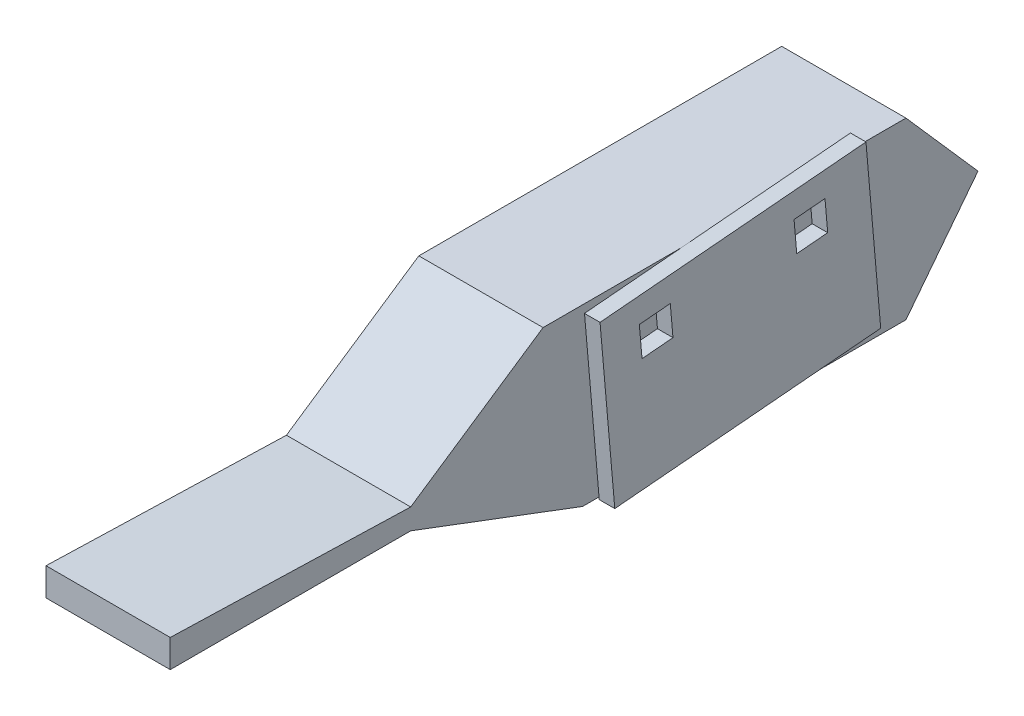
ISO-10303-21;
HEADER;
FILE_DESCRIPTION(('STEP AP214'),'2;1');
FILE_NAME('part.step','',(''),(''),'','','');
FILE_SCHEMA(('AUTOMOTIVE_DESIGN { 1 0 10303 214 1 1 1 1 }'));
ENDSEC;
DATA;
#1=APPLICATION_CONTEXT('core data for automotive mechanical design processes');
#2=APPLICATION_PROTOCOL_DEFINITION('international standard','automotive_design',2000,#1);
#3=PRODUCT_CONTEXT('',#1,'mechanical');
#4=PRODUCT('Part','Part','',(#3));
#5=PRODUCT_RELATED_PRODUCT_CATEGORY('part','',(#4));
#6=PRODUCT_DEFINITION_FORMATION('','',#4);
#7=PRODUCT_DEFINITION_CONTEXT('part definition',#1,'design');
#8=PRODUCT_DEFINITION('design','',#6,#7);
#9=PRODUCT_DEFINITION_SHAPE('','',#8);
#10=(LENGTH_UNIT() NAMED_UNIT(*) SI_UNIT(.MILLI.,.METRE.));
#11=(NAMED_UNIT(*) PLANE_ANGLE_UNIT() SI_UNIT($,.RADIAN.));
#12=(NAMED_UNIT(*) SI_UNIT($,.STERADIAN.) SOLID_ANGLE_UNIT());
#13=UNCERTAINTY_MEASURE_WITH_UNIT(LENGTH_MEASURE(1.E-05),#10,'distance_accuracy_value','');
#14=(GEOMETRIC_REPRESENTATION_CONTEXT(3) GLOBAL_UNCERTAINTY_ASSIGNED_CONTEXT((#13)) GLOBAL_UNIT_ASSIGNED_CONTEXT((#10,
#11,#12)) REPRESENTATION_CONTEXT('',''));
#15=CARTESIAN_POINT('',(0.,0.,0.));
#16=DIRECTION('',(0.,0.,1.));
#17=DIRECTION('',(1.,0.,0.));
#18=AXIS2_PLACEMENT_3D('',#15,#16,#17);
#19=CARTESIAN_POINT('',(12.7,0.,0.));
#20=DIRECTION('',(1.,0.,0.));
#21=DIRECTION('',(0.,0.,-1.));
#22=AXIS2_PLACEMENT_3D('',#19,#20,#21);
#23=PLANE('',#22);
#24=DIRECTION('',(0.,-0.996194698091746,-0.0871557427476585));
#25=VECTOR('',#24,1.);
#26=CARTESIAN_POINT('',(12.7,-17.985294414633,29.7471624312923));
#27=LINE('',#26,#25);
#28=CARTESIAN_POINT('',(12.7,16.5040211284524,32.7645865540807));
#29=VERTEX_POINT('',#28);
#30=CARTESIAN_POINT('',(12.7,-17.4885188657028,29.7906246601406));
#31=VERTEX_POINT('',#30);
#32=EDGE_CURVE('E58',#29,#31,#27,.T.);
#33=ORIENTED_EDGE('',*,*,#32,.F.);
#34=DIRECTION('',(0.,-0.0871557427476582,0.996194698091745));
#35=VECTOR('',#34,1.);
#36=CARTESIAN_POINT('',(12.7,16.5040211284524,32.7645865540807));
#37=LINE('',#36,#35);
#38=CARTESIAN_POINT('',(12.7,18.2248775547851,13.0951075955551));
#39=VERTEX_POINT('',#38);
#40=EDGE_CURVE('E11',#39,#29,#37,.T.);
#41=ORIENTED_EDGE('',*,*,#40,.F.);
#42=DIRECTION('',(0.,0.,1.));
#43=VECTOR('',#42,1.);
#44=CARTESIAN_POINT('',(12.7,18.2248775547851,41.2360865886046));
#45=LINE('',#44,#43);
#46=CARTESIAN_POINT('',(12.7,18.2248775547851,41.2360865886046));
#47=VERTEX_POINT('',#46);
#48=EDGE_CURVE('E363',#39,#47,#45,.T.);
#49=ORIENTED_EDGE('',*,*,#48,.T.);
#50=DIRECTION('',(0.,-0.558600379479065,0.829436927105277));
#51=VECTOR('',#50,1.);
#52=CARTESIAN_POINT('',(12.7,0.,68.2972684123763));
#53=LINE('',#52,#51);
#54=CARTESIAN_POINT('',(12.7,0.,68.2972684123763));
#55=VERTEX_POINT('',#54);
#56=EDGE_CURVE('E368',#47,#55,#53,.T.);
#57=ORIENTED_EDGE('',*,*,#56,.T.);
#58=DIRECTION('',(0.,0.0299491063641705,0.999551424904185));
#59=VECTOR('',#58,1.);
#60=CARTESIAN_POINT('',(12.7,1.47271737816446,117.449210908615));
#61=LINE('',#60,#59);
#62=CARTESIAN_POINT('',(12.7,1.47271737816446,117.449210908615));
#63=VERTEX_POINT('',#62);
#64=EDGE_CURVE('E338',#55,#63,#61,.T.);
#65=ORIENTED_EDGE('',*,*,#64,.T.);
#66=DIRECTION('',(0.,-1.,0.));
#67=VECTOR('',#66,1.);
#68=CARTESIAN_POINT('',(12.7,-4.23406246222278,117.449210908615));
#69=LINE('',#68,#67);
#70=CARTESIAN_POINT('',(12.7,-4.23406246222278,117.449210908615));
#71=VERTEX_POINT('',#70);
#72=EDGE_CURVE('E342',#63,#71,#69,.T.);
#73=ORIENTED_EDGE('',*,*,#72,.T.);
#74=DIRECTION('',(0.,0.,-1.));
#75=VECTOR('',#74,1.);
#76=CARTESIAN_POINT('',(12.7,-4.23406246222278,68.2972684123763));
#77=LINE('',#76,#75);
#78=CARTESIAN_POINT('',(12.7,-4.23406246222278,68.2972684123763));
#79=VERTEX_POINT('',#78);
#80=EDGE_CURVE('E346',#71,#79,#77,.T.);
#81=ORIENTED_EDGE('',*,*,#80,.T.);
#82=DIRECTION('',(0.,-0.35273357770288,-0.935723796406251));
#83=VECTOR('',#82,1.);
#84=CARTESIAN_POINT('',(12.7,-17.4885188657028,33.1361410087001));
#85=LINE('',#84,#83);
#86=CARTESIAN_POINT('',(12.7,-17.4885188657028,33.1361410087001));
#87=VERTEX_POINT('',#86);
#88=EDGE_CURVE('E349',#79,#87,#85,.T.);
#89=ORIENTED_EDGE('',*,*,#88,.T.);
#90=DIRECTION('',(0.,0.,-1.));
#91=VECTOR('',#90,1.);
#92=CARTESIAN_POINT('',(12.7,-17.4885188657028,-32.9520513364295));
#93=LINE('',#92,#91);
#94=EDGE_CURVE('E353',#87,#31,#93,.T.);
#95=ORIENTED_EDGE('',*,*,#94,.T.);
#96=EDGE_LOOP('',(#33,#41,#49,#57,#65,#73,#81,#89,#95));
#97=FACE_BOUND('',#96,.T.);
#98=ADVANCED_FACE('F39',(#97),#23,.T.);
#99=CARTESIAN_POINT('',(12.7,1.47271737816446,117.449210908615));
#100=DIRECTION('',(0.,-0.999551424904185,0.0299491063641705));
#101=DIRECTION('',(0.,-0.0299491063641705,-0.999551424904185));
#102=AXIS2_PLACEMENT_3D('',#99,#100,#101);
#103=PLANE('',#102);
#104=DIRECTION('',(0.,0.0299491063641705,0.999551424904185));
#105=VECTOR('',#104,1.);
#106=CARTESIAN_POINT('',(-12.7,1.47271737816446,117.449210908615));
#107=LINE('',#106,#105);
#108=CARTESIAN_POINT('',(-12.7,0.,68.2972684123763));
#109=VERTEX_POINT('',#108);
#110=CARTESIAN_POINT('',(-12.7,1.47271737816446,117.449210908615));
#111=VERTEX_POINT('',#110);
#112=EDGE_CURVE('E337',#109,#111,#107,.T.);
#113=ORIENTED_EDGE('',*,*,#112,.T.);
#114=DIRECTION('',(-1.,0.,0.));
#115=VECTOR('',#114,1.);
#116=CARTESIAN_POINT('',(12.7,1.47271737816446,117.449210908615));
#117=LINE('',#116,#115);
#118=EDGE_CURVE('E43',#63,#111,#117,.T.);
#119=ORIENTED_EDGE('',*,*,#118,.F.);
#120=ORIENTED_EDGE('',*,*,#64,.F.);
#121=DIRECTION('',(-1.,0.,0.));
#122=VECTOR('',#121,1.);
#123=CARTESIAN_POINT('',(12.7,0.,68.2972684123763));
#124=LINE('',#123,#122);
#125=EDGE_CURVE('E372',#55,#109,#124,.T.);
#126=ORIENTED_EDGE('',*,*,#125,.T.);
#127=EDGE_LOOP('',(#113,#119,#120,#126));
#128=FACE_BOUND('',#127,.T.);
#129=ADVANCED_FACE('F41',(#128),#103,.F.);
#130=CARTESIAN_POINT('',(12.7,-4.23406246222278,117.449210908615));
#131=DIRECTION('',(0.,0.,-1.));
#132=DIRECTION('',(-1.,0.,0.));
#133=AXIS2_PLACEMENT_3D('',#130,#131,#132);
#134=PLANE('',#133);
#135=DIRECTION('',(0.,-1.,0.));
#136=VECTOR('',#135,1.);
#137=CARTESIAN_POINT('',(-12.7,-4.23406246222278,117.449210908615));
#138=LINE('',#137,#136);
#139=CARTESIAN_POINT('',(-12.7,-4.23406246222278,117.449210908615));
#140=VERTEX_POINT('',#139);
#141=EDGE_CURVE('E376',#111,#140,#138,.T.);
#142=ORIENTED_EDGE('',*,*,#141,.T.);
#143=DIRECTION('',(-1.,0.,0.));
#144=VECTOR('',#143,1.);
#145=CARTESIAN_POINT('',(12.7,-4.23406246222278,117.449210908615));
#146=LINE('',#145,#144);
#147=EDGE_CURVE('E425',#71,#140,#146,.T.);
#148=ORIENTED_EDGE('',*,*,#147,.F.);
#149=ORIENTED_EDGE('',*,*,#72,.F.);
#150=ORIENTED_EDGE('',*,*,#118,.T.);
#151=EDGE_LOOP('',(#142,#148,#149,#150));
#152=FACE_BOUND('',#151,.T.);
#153=ADVANCED_FACE('F505',(#152),#134,.F.);
#154=CARTESIAN_POINT('',(12.7,-4.23406246222278,68.2972684123763));
#155=DIRECTION('',(0.,1.,0.));
#156=DIRECTION('',(0.,0.,1.));
#157=AXIS2_PLACEMENT_3D('',#154,#155,#156);
#158=PLANE('',#157);
#159=DIRECTION('',(0.,0.,-1.));
#160=VECTOR('',#159,1.);
#161=CARTESIAN_POINT('',(-12.7,-4.23406246222278,68.2972684123763));
#162=LINE('',#161,#160);
#163=CARTESIAN_POINT('',(-12.7,-4.23406246222278,68.2972684123763));
#164=VERTEX_POINT('',#163);
#165=EDGE_CURVE('E379',#140,#164,#162,.T.);
#166=ORIENTED_EDGE('',*,*,#165,.T.);
#167=DIRECTION('',(-1.,0.,0.));
#168=VECTOR('',#167,1.);
#169=CARTESIAN_POINT('',(12.7,-4.23406246222278,68.2972684123763));
#170=LINE('',#169,#168);
#171=EDGE_CURVE('E422',#79,#164,#170,.T.);
#172=ORIENTED_EDGE('',*,*,#171,.F.);
#173=ORIENTED_EDGE('',*,*,#80,.F.);
#174=ORIENTED_EDGE('',*,*,#147,.T.);
#175=EDGE_LOOP('',(#166,#172,#173,#174));
#176=FACE_BOUND('',#175,.T.);
#177=ADVANCED_FACE('F507',(#176),#158,.F.);
#178=CARTESIAN_POINT('',(12.7,-17.4885188657028,33.1361410087001));
#179=DIRECTION('',(0.,0.935723796406251,-0.35273357770288));
#180=DIRECTION('',(0.,0.35273357770288,0.935723796406251));
#181=AXIS2_PLACEMENT_3D('',#178,#179,#180);
#182=PLANE('',#181);
#183=DIRECTION('',(0.,-0.35273357770288,-0.935723796406251));
#184=VECTOR('',#183,1.);
#185=CARTESIAN_POINT('',(-12.7,-17.4885188657028,33.1361410087001));
#186=LINE('',#185,#184);
#187=CARTESIAN_POINT('',(-12.7,-17.4885188657028,33.1361410087001));
#188=VERTEX_POINT('',#187);
#189=EDGE_CURVE('E382',#164,#188,#186,.T.);
#190=ORIENTED_EDGE('',*,*,#189,.T.);
#191=DIRECTION('',(-1.,0.,0.));
#192=VECTOR('',#191,1.);
#193=CARTESIAN_POINT('',(12.7,-17.4885188657028,33.1361410087001));
#194=LINE('',#193,#192);
#195=EDGE_CURVE('E418',#87,#188,#194,.T.);
#196=ORIENTED_EDGE('',*,*,#195,.F.);
#197=ORIENTED_EDGE('',*,*,#88,.F.);
#198=ORIENTED_EDGE('',*,*,#171,.T.);
#199=EDGE_LOOP('',(#190,#196,#197,#198));
#200=FACE_BOUND('',#199,.T.);
#201=ADVANCED_FACE('F511',(#200),#182,.F.);
#202=CARTESIAN_POINT('',(12.7,-17.4885188657028,-32.9520513364295));
#203=DIRECTION('',(0.,1.,0.));
#204=DIRECTION('',(0.,0.,1.));
#205=AXIS2_PLACEMENT_3D('',#202,#203,#204);
#206=PLANE('',#205);
#207=DIRECTION('',(0.,0.,-1.));
#208=VECTOR('',#207,1.);
#209=CARTESIAN_POINT('',(-12.7,-17.4885188657028,-32.9520513364295));
#210=LINE('',#209,#208);
#211=CARTESIAN_POINT('',(-12.7,-17.4885188657028,-32.9520513364295));
#212=VERTEX_POINT('',#211);
#213=EDGE_CURVE('E385',#188,#212,#210,.T.);
#214=ORIENTED_EDGE('',*,*,#213,.T.);
#215=DIRECTION('',(-1.,0.,0.));
#216=VECTOR('',#215,1.);
#217=CARTESIAN_POINT('',(12.7,-17.4885188657028,-32.9520513364295));
#218=LINE('',#217,#216);
#219=CARTESIAN_POINT('',(12.7,-17.4885188657028,-32.9520513364295));
#220=VERTEX_POINT('',#219);
#221=EDGE_CURVE('E414',#220,#212,#218,.T.);
#222=ORIENTED_EDGE('',*,*,#221,.F.);
#223=CARTESIAN_POINT('',(12.7,-17.4885188657029,24.0689919242895));
#224=VERTEX_POINT('',#223);
#225=EDGE_CURVE('E352',#224,#220,#93,.T.);
#226=ORIENTED_EDGE('',*,*,#225,.F.);
#227=EDGE_CURVE('E357',#31,#224,#93,.T.);
#228=ORIENTED_EDGE('',*,*,#227,.F.);
#229=ORIENTED_EDGE('',*,*,#94,.F.);
#230=ORIENTED_EDGE('',*,*,#195,.T.);
#231=EDGE_LOOP('',(#214,#222,#226,#228,#229,#230));
#232=FACE_BOUND('',#231,.T.);
#233=ADVANCED_FACE('F468',(#232),#206,.F.);
#234=CARTESIAN_POINT('',(12.7,1.47271737816446,-47.679225118074));
#235=DIRECTION('',(0.,0.613409639422925,0.789764910757015));
#236=DIRECTION('',(0.,-0.789764910757015,0.613409639422925));
#237=AXIS2_PLACEMENT_3D('',#234,#235,#236);
#238=PLANE('',#237);
#239=DIRECTION('',(0.,0.789764910757015,-0.613409639422925));
#240=VECTOR('',#239,1.);
#241=CARTESIAN_POINT('',(-12.7,1.47271737816446,-47.679225118074));
#242=LINE('',#241,#240);
#243=CARTESIAN_POINT('',(-12.7,1.47271737816446,-47.679225118074));
#244=VERTEX_POINT('',#243);
#245=EDGE_CURVE('E388',#212,#244,#242,.T.);
#246=ORIENTED_EDGE('',*,*,#245,.T.);
#247=DIRECTION('',(-1.,0.,0.));
#248=VECTOR('',#247,1.);
#249=CARTESIAN_POINT('',(12.7,1.47271737816446,-47.679225118074));
#250=LINE('',#249,#248);
#251=CARTESIAN_POINT('',(12.7,1.47271737816446,-47.679225118074));
#252=VERTEX_POINT('',#251);
#253=EDGE_CURVE('E410',#252,#244,#250,.T.);
#254=ORIENTED_EDGE('',*,*,#253,.F.);
#255=DIRECTION('',(0.,0.789764910757015,-0.613409639422925));
#256=VECTOR('',#255,1.);
#257=CARTESIAN_POINT('',(12.7,1.47271737816446,-47.679225118074));
#258=LINE('',#257,#256);
#259=EDGE_CURVE('E356',#220,#252,#258,.T.);
#260=ORIENTED_EDGE('',*,*,#259,.F.);
#261=ORIENTED_EDGE('',*,*,#221,.T.);
#262=EDGE_LOOP('',(#246,#254,#260,#261));
#263=FACE_BOUND('',#262,.T.);
#264=ADVANCED_FACE('F472',(#263),#238,.F.);
#265=CARTESIAN_POINT('',(12.7,18.2248775547851,-32.9520513364295));
#266=DIRECTION('',(0.,-0.660255712909839,0.751040873434941));
#267=DIRECTION('',(0.,-0.751040873434942,-0.66025571290984));
#268=AXIS2_PLACEMENT_3D('',#265,#266,#267);
#269=PLANE('',#268);
#270=DIRECTION('',(0.,0.751040873434941,0.660255712909839));
#271=VECTOR('',#270,1.);
#272=CARTESIAN_POINT('',(-12.7,18.2248775547851,-32.9520513364295));
#273=LINE('',#272,#271);
#274=CARTESIAN_POINT('',(-12.7,18.2248775547851,-32.9520513364295));
#275=VERTEX_POINT('',#274);
#276=EDGE_CURVE('E391',#244,#275,#273,.T.);
#277=ORIENTED_EDGE('',*,*,#276,.T.);
#278=DIRECTION('',(-1.,0.,0.));
#279=VECTOR('',#278,1.);
#280=CARTESIAN_POINT('',(12.7,18.2248775547851,-32.9520513364295));
#281=LINE('',#280,#279);
#282=CARTESIAN_POINT('',(12.7,18.2248775547851,-32.9520513364295));
#283=VERTEX_POINT('',#282);
#284=EDGE_CURVE('E406',#283,#275,#281,.T.);
#285=ORIENTED_EDGE('',*,*,#284,.F.);
#286=DIRECTION('',(0.,0.751040873434941,0.660255712909839));
#287=VECTOR('',#286,1.);
#288=CARTESIAN_POINT('',(12.7,18.2248775547851,-32.9520513364295));
#289=LINE('',#288,#287);
#290=EDGE_CURVE('E360',#252,#283,#289,.T.);
#291=ORIENTED_EDGE('',*,*,#290,.F.);
#292=ORIENTED_EDGE('',*,*,#253,.T.);
#293=EDGE_LOOP('',(#277,#285,#291,#292));
#294=FACE_BOUND('',#293,.T.);
#295=ADVANCED_FACE('F477',(#294),#269,.F.);
#296=CARTESIAN_POINT('',(12.7,18.2248775547851,41.2360865886046));
#297=DIRECTION('',(0.,-1.,0.));
#298=DIRECTION('',(0.,0.,-1.));
#299=AXIS2_PLACEMENT_3D('',#296,#297,#298);
#300=PLANE('',#299);
#301=DIRECTION('',(0.,0.,1.));
#302=VECTOR('',#301,1.);
#303=CARTESIAN_POINT('',(-12.7,18.2248775547851,41.2360865886046));
#304=LINE('',#303,#302);
#305=CARTESIAN_POINT('',(-12.7,18.2248775547851,41.2360865886046));
#306=VERTEX_POINT('',#305);
#307=EDGE_CURVE('E394',#275,#306,#304,.T.);
#308=ORIENTED_EDGE('',*,*,#307,.T.);
#309=DIRECTION('',(-1.,0.,0.));
#310=VECTOR('',#309,1.);
#311=CARTESIAN_POINT('',(12.7,18.2248775547851,41.2360865886046));
#312=LINE('',#311,#310);
#313=EDGE_CURVE('E402',#47,#306,#312,.T.);
#314=ORIENTED_EDGE('',*,*,#313,.F.);
#315=ORIENTED_EDGE('',*,*,#48,.F.);
#316=CARTESIAN_POINT('',(12.7,18.2248775547851,-21.8657514421866));
#317=VERTEX_POINT('',#316);
#318=EDGE_CURVE('E369',#317,#39,#45,.T.);
#319=ORIENTED_EDGE('',*,*,#318,.F.);
#320=EDGE_CURVE('E364',#283,#317,#45,.T.);
#321=ORIENTED_EDGE('',*,*,#320,.F.);
#322=ORIENTED_EDGE('',*,*,#284,.T.);
#323=EDGE_LOOP('',(#308,#314,#315,#319,#321,#322));
#324=FACE_BOUND('',#323,.T.);
#325=ADVANCED_FACE('F490',(#324),#300,.F.);
#326=CARTESIAN_POINT('',(12.7,0.,68.2972684123763));
#327=DIRECTION('',(0.,-0.829436927105277,-0.558600379479065));
#328=DIRECTION('',(0.,0.558600379479065,-0.829436927105277));
#329=AXIS2_PLACEMENT_3D('',#326,#327,#328);
#330=PLANE('',#329);
#331=DIRECTION('',(0.,-0.558600379479065,0.829436927105277));
#332=VECTOR('',#331,1.);
#333=CARTESIAN_POINT('',(-12.7,0.,68.2972684123763));
#334=LINE('',#333,#332);
#335=EDGE_CURVE('E343',#306,#109,#334,.T.);
#336=ORIENTED_EDGE('',*,*,#335,.T.);
#337=ORIENTED_EDGE('',*,*,#125,.F.);
#338=ORIENTED_EDGE('',*,*,#56,.F.);
#339=ORIENTED_EDGE('',*,*,#313,.T.);
#340=EDGE_LOOP('',(#336,#337,#338,#339));
#341=FACE_BOUND('',#340,.T.);
#342=ADVANCED_FACE('F498',(#341),#330,.F.);
#343=DIRECTION('',(0.,0.996194698091745,0.0871557427476602));
#344=VECTOR('',#343,1.);
#345=CARTESIAN_POINT('',(12.7,-13.2289932575131,-24.6176085622717));
#346=LINE('',#345,#344);
#347=CARTESIAN_POINT('',(12.7,-13.2289932575131,-24.6176085622717));
#348=VERTEX_POINT('',#347);
#349=EDGE_CURVE('E316',#348,#317,#346,.T.);
#350=ORIENTED_EDGE('',*,*,#349,.F.);
#351=DIRECTION('',(0.,0.0871557427476583,-0.996194698091745));
#352=VECTOR('',#351,1.);
#353=CARTESIAN_POINT('',(12.7,-17.985294414633,29.7471624312923));
#354=LINE('',#353,#352);
#355=EDGE_CURVE('E49',#224,#348,#354,.T.);
#356=ORIENTED_EDGE('',*,*,#355,.F.);
#357=ORIENTED_EDGE('',*,*,#225,.T.);
#358=ORIENTED_EDGE('',*,*,#259,.T.);
#359=ORIENTED_EDGE('',*,*,#290,.T.);
#360=ORIENTED_EDGE('',*,*,#320,.T.);
#361=EDGE_LOOP('',(#350,#356,#357,#358,#359,#360));
#362=FACE_BOUND('',#361,.T.);
#363=ADVANCED_FACE('F465',(#362),#23,.T.);
#364=CARTESIAN_POINT('',(-12.7,0.,0.));
#365=DIRECTION('',(1.,0.,0.));
#366=DIRECTION('',(0.,0.,-1.));
#367=AXIS2_PLACEMENT_3D('',#364,#365,#366);
#368=PLANE('',#367);
#369=ORIENTED_EDGE('',*,*,#112,.F.);
#370=ORIENTED_EDGE('',*,*,#335,.F.);
#371=ORIENTED_EDGE('',*,*,#307,.F.);
#372=ORIENTED_EDGE('',*,*,#276,.F.);
#373=ORIENTED_EDGE('',*,*,#245,.F.);
#374=ORIENTED_EDGE('',*,*,#213,.F.);
#375=ORIENTED_EDGE('',*,*,#189,.F.);
#376=ORIENTED_EDGE('',*,*,#165,.F.);
#377=ORIENTED_EDGE('',*,*,#141,.F.);
#378=EDGE_LOOP('',(#369,#370,#371,#372,#373,#374,#375,#376,#377));
#379=FACE_BOUND('',#378,.T.);
#380=ADVANCED_FACE('F503',(#379),#368,.F.);
#381=CARTESIAN_POINT('',(12.7,0.,0.));
#382=DIRECTION('',(-1.,0.,0.));
#383=DIRECTION('',(0.,0.,1.));
#384=AXIS2_PLACEMENT_3D('',#381,#382,#383);
#385=PLANE('',#384);
#386=CARTESIAN_POINT('',(12.7,-17.985294414633,29.7471624312923));
#387=VERTEX_POINT('',#386);
#388=EDGE_CURVE('E294',#31,#387,#27,.T.);
#389=ORIENTED_EDGE('',*,*,#388,.F.);
#390=ORIENTED_EDGE('',*,*,#227,.T.);
#391=EDGE_CURVE('E311',#387,#224,#354,.T.);
#392=ORIENTED_EDGE('',*,*,#391,.F.);
#393=EDGE_LOOP('',(#389,#390,#392));
#394=FACE_BOUND('',#393,.T.);
#395=ADVANCED_FACE('F459',(#394),#385,.T.);
#396=CARTESIAN_POINT('',(15.875,0.,0.));
#397=DIRECTION('',(-1.,0.,0.));
#398=DIRECTION('',(0.,0.,1.));
#399=AXIS2_PLACEMENT_3D('',#396,#397,#398);
#400=PLANE('',#399);
#401=DIRECTION('',(0.,-0.996194698091745,-0.0871557427476588));
#402=VECTOR('',#401,1.);
#403=CARTESIAN_POINT('',(15.875,5.78164248900088,24.1773928150159));
#404=LINE('',#403,#402);
#405=CARTESIAN_POINT('',(15.875,12.1074788218835,24.7308317814635));
#406=VERTEX_POINT('',#405);
#407=CARTESIAN_POINT('',(15.875,5.78164248900088,24.1773928150159));
#408=VERTEX_POINT('',#407);
#409=EDGE_CURVE('E255',#406,#408,#404,.T.);
#410=ORIENTED_EDGE('',*,*,#409,.F.);
#411=DIRECTION('',(0.,-0.087155742747658,0.996194698091746));
#412=VECTOR('',#411,1.);
#413=CARTESIAN_POINT('',(15.875,12.1074788218835,24.7308317814635));
#414=LINE('',#413,#412);
#415=CARTESIAN_POINT('',(15.875,12.6609177883311,18.404995448581));
#416=VERTEX_POINT('',#415);
#417=EDGE_CURVE('E265',#416,#406,#414,.T.);
#418=ORIENTED_EDGE('',*,*,#417,.F.);
#419=DIRECTION('',(0.,0.996194698091745,0.0871557427476588));
#420=VECTOR('',#419,1.);
#421=CARTESIAN_POINT('',(15.875,6.33508145544851,17.8515564821333));
#422=LINE('',#421,#420);
#423=CARTESIAN_POINT('',(15.875,6.33508145544851,17.8515564821333));
#424=VERTEX_POINT('',#423);
#425=EDGE_CURVE('E261',#424,#416,#422,.T.);
#426=ORIENTED_EDGE('',*,*,#425,.F.);
#427=DIRECTION('',(0.,0.0871557427476583,-0.996194698091746));
#428=VECTOR('',#427,1.);
#429=CARTESIAN_POINT('',(15.875,5.78164248900088,24.1773928150159));
#430=LINE('',#429,#428);
#431=EDGE_CURVE('E258',#408,#424,#430,.T.);
#432=ORIENTED_EDGE('',*,*,#431,.F.);
#433=EDGE_LOOP('',(#410,#418,#426,#432));
#434=FACE_BOUND('',#433,.T.);
#435=DIRECTION('',(0.,-0.996194698091746,-0.0871557427476585));
#436=VECTOR('',#435,1.);
#437=CARTESIAN_POINT('',(15.875,-17.985294414633,29.7471624312923));
#438=LINE('',#437,#436);
#439=CARTESIAN_POINT('',(15.875,16.5040211284524,32.7645865540807));
#440=VERTEX_POINT('',#439);
#441=CARTESIAN_POINT('',(15.875,-17.985294414633,29.7471624312923));
#442=VERTEX_POINT('',#441);
#443=EDGE_CURVE('E295',#440,#442,#438,.T.);
#444=ORIENTED_EDGE('',*,*,#443,.T.);
#445=DIRECTION('',(0.,0.0871557427476583,-0.996194698091745));
#446=VECTOR('',#445,1.);
#447=CARTESIAN_POINT('',(15.875,-17.985294414633,29.7471624312923));
#448=LINE('',#447,#446);
#449=CARTESIAN_POINT('',(15.875,-13.2289932575131,-24.6176085622717));
#450=VERTEX_POINT('',#449);
#451=EDGE_CURVE('E299',#442,#450,#448,.T.);
#452=ORIENTED_EDGE('',*,*,#451,.T.);
#453=DIRECTION('',(0.,0.996194698091745,0.0871557427476602));
#454=VECTOR('',#453,1.);
#455=CARTESIAN_POINT('',(15.875,-13.2289932575131,-24.6176085622717));
#456=LINE('',#455,#454);
#457=CARTESIAN_POINT('',(15.875,21.2603222855722,-21.6001844394833));
#458=VERTEX_POINT('',#457);
#459=EDGE_CURVE('E302',#450,#458,#456,.T.);
#460=ORIENTED_EDGE('',*,*,#459,.T.);
#461=DIRECTION('',(0.,-0.0871557427476582,0.996194698091745));
#462=VECTOR('',#461,1.);
#463=CARTESIAN_POINT('',(15.875,16.5040211284524,32.7645865540807));
#464=LINE('',#463,#462);
#465=EDGE_CURVE('E305',#458,#440,#464,.T.);
#466=ORIENTED_EDGE('',*,*,#465,.T.);
#467=EDGE_LOOP('',(#444,#452,#460,#466));
#468=FACE_BOUND('',#467,.T.);
#469=DIRECTION('',(0.,-0.996194698091745,-0.0871557427476602));
#470=VECTOR('',#469,1.);
#471=CARTESIAN_POINT('',(15.875,8.54883732123903,-7.451788849397));
#472=LINE('',#471,#470);
#473=CARTESIAN_POINT('',(15.875,14.8746736541216,-6.89834988294936));
#474=VERTEX_POINT('',#473);
#475=CARTESIAN_POINT('',(15.875,8.54883732123903,-7.451788849397));
#476=VERTEX_POINT('',#475);
#477=EDGE_CURVE('E200',#474,#476,#472,.T.);
#478=ORIENTED_EDGE('',*,*,#477,.F.);
#479=DIRECTION('',(0.,-0.0871557427476585,0.996194698091745));
#480=VECTOR('',#479,1.);
#481=CARTESIAN_POINT('',(15.875,14.8746736541216,-6.89834988294936));
#482=LINE('',#481,#480);
#483=CARTESIAN_POINT('',(15.875,15.4281126205692,-13.2241862158319));
#484=VERTEX_POINT('',#483);
#485=EDGE_CURVE('E230',#484,#474,#482,.T.);
#486=ORIENTED_EDGE('',*,*,#485,.F.);
#487=DIRECTION('',(0.,0.996194698091745,0.0871557427476601));
#488=VECTOR('',#487,1.);
#489=CARTESIAN_POINT('',(15.875,9.10227628768666,-13.7776251822796));
#490=LINE('',#489,#488);
#491=CARTESIAN_POINT('',(15.875,9.10227628768666,-13.7776251822796));
#492=VERTEX_POINT('',#491);
#493=EDGE_CURVE('E226',#492,#484,#490,.T.);
#494=ORIENTED_EDGE('',*,*,#493,.F.);
#495=DIRECTION('',(0.,0.087155742747658,-0.996194698091746));
#496=VECTOR('',#495,1.);
#497=CARTESIAN_POINT('',(15.875,8.54883732123903,-7.451788849397));
#498=LINE('',#497,#496);
#499=EDGE_CURVE('E211',#476,#492,#498,.T.);
#500=ORIENTED_EDGE('',*,*,#499,.F.);
#501=EDGE_LOOP('',(#478,#486,#494,#500));
#502=FACE_BOUND('',#501,.T.);
#503=ADVANCED_FACE('F224',(#434,#468,#502),#400,.F.);
#504=CARTESIAN_POINT('',(12.7,21.2603222855722,-21.6001844394833));
#505=VERTEX_POINT('',#504);
#506=EDGE_CURVE('E315',#317,#505,#346,.T.);
#507=ORIENTED_EDGE('',*,*,#506,.F.);
#508=ORIENTED_EDGE('',*,*,#318,.T.);
#509=EDGE_CURVE('E51',#505,#39,#37,.T.);
#510=ORIENTED_EDGE('',*,*,#509,.F.);
#511=EDGE_LOOP('',(#507,#508,#510));
#512=FACE_BOUND('',#511,.T.);
#513=ADVANCED_FACE('F484',(#512),#385,.T.);
#514=CARTESIAN_POINT('',(15.875,-17.985294414633,29.7471624312923));
#515=DIRECTION('',(0.,0.0871557427476585,-0.996194698091745));
#516=DIRECTION('',(0.,0.996194698091746,0.0871557427476585));
#517=AXIS2_PLACEMENT_3D('',#514,#515,#516);
#518=PLANE('',#517);
#519=ORIENTED_EDGE('',*,*,#32,.T.);
#520=ORIENTED_EDGE('',*,*,#388,.T.);
#521=DIRECTION('',(-1.,0.,0.));
#522=VECTOR('',#521,1.);
#523=CARTESIAN_POINT('',(15.875,-17.985294414633,29.7471624312923));
#524=LINE('',#523,#522);
#525=EDGE_CURVE('E333',#442,#387,#524,.T.);
#526=ORIENTED_EDGE('',*,*,#525,.F.);
#527=ORIENTED_EDGE('',*,*,#443,.F.);
#528=DIRECTION('',(-1.,0.,0.));
#529=VECTOR('',#528,1.);
#530=CARTESIAN_POINT('',(15.875,16.5040211284524,32.7645865540807));
#531=LINE('',#530,#529);
#532=EDGE_CURVE('E308',#440,#29,#531,.T.);
#533=ORIENTED_EDGE('',*,*,#532,.T.);
#534=EDGE_LOOP('',(#519,#520,#526,#527,#533));
#535=FACE_BOUND('',#534,.T.);
#536=ADVANCED_FACE('F454',(#535),#518,.F.);
#537=CARTESIAN_POINT('',(15.875,-17.985294414633,29.7471624312923));
#538=DIRECTION('',(0.,0.996194698091746,0.0871557427476583));
#539=DIRECTION('',(0.,-0.0871557427476583,0.996194698091746));
#540=AXIS2_PLACEMENT_3D('',#537,#538,#539);
#541=PLANE('',#540);
#542=ORIENTED_EDGE('',*,*,#391,.T.);
#543=ORIENTED_EDGE('',*,*,#355,.T.);
#544=DIRECTION('',(-1.,0.,0.));
#545=VECTOR('',#544,1.);
#546=CARTESIAN_POINT('',(15.875,-13.2289932575131,-24.6176085622717));
#547=LINE('',#546,#545);
#548=EDGE_CURVE('E329',#450,#348,#547,.T.);
#549=ORIENTED_EDGE('',*,*,#548,.F.);
#550=ORIENTED_EDGE('',*,*,#451,.F.);
#551=ORIENTED_EDGE('',*,*,#525,.T.);
#552=EDGE_LOOP('',(#542,#543,#549,#550,#551));
#553=FACE_BOUND('',#552,.T.);
#554=ADVANCED_FACE('F440',(#553),#541,.F.);
#555=CARTESIAN_POINT('',(15.875,-13.2289932575131,-24.6176085622717));
#556=DIRECTION('',(0.,-0.0871557427476602,0.996194698091745));
#557=DIRECTION('',(0.,-0.996194698091745,-0.0871557427476602));
#558=AXIS2_PLACEMENT_3D('',#555,#556,#557);
#559=PLANE('',#558);
#560=ORIENTED_EDGE('',*,*,#349,.T.);
#561=ORIENTED_EDGE('',*,*,#506,.T.);
#562=DIRECTION('',(-1.,0.,0.));
#563=VECTOR('',#562,1.);
#564=CARTESIAN_POINT('',(15.875,21.2603222855722,-21.6001844394833));
#565=LINE('',#564,#563);
#566=EDGE_CURVE('E325',#458,#505,#565,.T.);
#567=ORIENTED_EDGE('',*,*,#566,.F.);
#568=ORIENTED_EDGE('',*,*,#459,.F.);
#569=ORIENTED_EDGE('',*,*,#548,.T.);
#570=EDGE_LOOP('',(#560,#561,#567,#568,#569));
#571=FACE_BOUND('',#570,.T.);
#572=ADVANCED_FACE('F446',(#571),#559,.F.);
#573=CARTESIAN_POINT('',(15.875,16.5040211284524,32.7645865540807));
#574=DIRECTION('',(0.,-0.996194698091746,-0.0871557427476582));
#575=DIRECTION('',(0.,0.0871557427476582,-0.996194698091746));
#576=AXIS2_PLACEMENT_3D('',#573,#574,#575);
#577=PLANE('',#576);
#578=ORIENTED_EDGE('',*,*,#509,.T.);
#579=ORIENTED_EDGE('',*,*,#40,.T.);
#580=ORIENTED_EDGE('',*,*,#532,.F.);
#581=ORIENTED_EDGE('',*,*,#465,.F.);
#582=ORIENTED_EDGE('',*,*,#566,.T.);
#583=EDGE_LOOP('',(#578,#579,#580,#581,#582));
#584=FACE_BOUND('',#583,.T.);
#585=ADVANCED_FACE('F487',(#584),#577,.F.);
#586=CARTESIAN_POINT('',(15.875,5.78164248900088,24.1773928150159));
#587=DIRECTION('',(0.,0.0871557427476588,-0.996194698091745));
#588=DIRECTION('',(0.,0.996194698091746,0.0871557427476588));
#589=AXIS2_PLACEMENT_3D('',#586,#587,#588);
#590=PLANE('',#589);
#591=DIRECTION('',(0.,-0.996194698091745,-0.0871557427476588));
#592=VECTOR('',#591,1.);
#593=CARTESIAN_POINT('',(12.7,5.78164248900088,24.1773928150159));
#594=LINE('',#593,#592);
#595=CARTESIAN_POINT('',(12.7,12.1074788218835,24.7308317814636));
#596=VERTEX_POINT('',#595);
#597=CARTESIAN_POINT('',(12.7,5.78164248900088,24.1773928150159));
#598=VERTEX_POINT('',#597);
#599=EDGE_CURVE('E220',#596,#598,#594,.T.);
#600=ORIENTED_EDGE('',*,*,#599,.F.);
#601=DIRECTION('',(-1.,0.,0.));
#602=VECTOR('',#601,1.);
#603=CARTESIAN_POINT('',(15.875,12.1074788218835,24.7308317814635));
#604=LINE('',#603,#602);
#605=EDGE_CURVE('E268',#406,#596,#604,.T.);
#606=ORIENTED_EDGE('',*,*,#605,.F.);
#607=ORIENTED_EDGE('',*,*,#409,.T.);
#608=DIRECTION('',(-1.,0.,0.));
#609=VECTOR('',#608,1.);
#610=CARTESIAN_POINT('',(15.875,5.78164248900088,24.1773928150159));
#611=LINE('',#610,#609);
#612=EDGE_CURVE('E290',#408,#598,#611,.T.);
#613=ORIENTED_EDGE('',*,*,#612,.T.);
#614=EDGE_LOOP('',(#600,#606,#607,#613));
#615=FACE_BOUND('',#614,.T.);
#616=ADVANCED_FACE('F567',(#615),#590,.T.);
#617=CARTESIAN_POINT('',(15.875,5.78164248900088,24.1773928150159));
#618=DIRECTION('',(0.,0.996194698091746,0.0871557427476583));
#619=DIRECTION('',(0.,-0.0871557427476583,0.996194698091746));
#620=AXIS2_PLACEMENT_3D('',#617,#618,#619);
#621=PLANE('',#620);
#622=DIRECTION('',(0.,0.0871557427476583,-0.996194698091746));
#623=VECTOR('',#622,1.);
#624=CARTESIAN_POINT('',(12.7,5.78164248900088,24.1773928150159));
#625=LINE('',#624,#623);
#626=CARTESIAN_POINT('',(12.7,6.33508145544851,17.8515564821333));
#627=VERTEX_POINT('',#626);
#628=EDGE_CURVE('E272',#598,#627,#625,.T.);
#629=ORIENTED_EDGE('',*,*,#628,.F.);
#630=ORIENTED_EDGE('',*,*,#612,.F.);
#631=ORIENTED_EDGE('',*,*,#431,.T.);
#632=DIRECTION('',(-1.,0.,0.));
#633=VECTOR('',#632,1.);
#634=CARTESIAN_POINT('',(15.875,6.33508145544851,17.8515564821333));
#635=LINE('',#634,#633);
#636=EDGE_CURVE('E287',#424,#627,#635,.T.);
#637=ORIENTED_EDGE('',*,*,#636,.T.);
#638=EDGE_LOOP('',(#629,#630,#631,#637));
#639=FACE_BOUND('',#638,.T.);
#640=ADVANCED_FACE('F563',(#639),#621,.T.);
#641=CARTESIAN_POINT('',(15.875,6.33508145544851,17.8515564821333));
#642=DIRECTION('',(0.,-0.0871557427476588,0.996194698091746));
#643=DIRECTION('',(0.,-0.996194698091745,-0.0871557427476588));
#644=AXIS2_PLACEMENT_3D('',#641,#642,#643);
#645=PLANE('',#644);
#646=DIRECTION('',(0.,0.996194698091745,0.0871557427476588));
#647=VECTOR('',#646,1.);
#648=CARTESIAN_POINT('',(12.7,6.33508145544851,17.8515564821333));
#649=LINE('',#648,#647);
#650=CARTESIAN_POINT('',(12.7,12.6609177883311,18.404995448581));
#651=VERTEX_POINT('',#650);
#652=EDGE_CURVE('E276',#627,#651,#649,.T.);
#653=ORIENTED_EDGE('',*,*,#652,.F.);
#654=ORIENTED_EDGE('',*,*,#636,.F.);
#655=ORIENTED_EDGE('',*,*,#425,.T.);
#656=DIRECTION('',(-1.,0.,0.));
#657=VECTOR('',#656,1.);
#658=CARTESIAN_POINT('',(15.875,12.6609177883311,18.404995448581));
#659=LINE('',#658,#657);
#660=EDGE_CURVE('E284',#416,#651,#659,.T.);
#661=ORIENTED_EDGE('',*,*,#660,.T.);
#662=EDGE_LOOP('',(#653,#654,#655,#661));
#663=FACE_BOUND('',#662,.T.);
#664=ADVANCED_FACE('F560',(#663),#645,.T.);
#665=CARTESIAN_POINT('',(15.875,12.1074788218835,24.7308317814635));
#666=DIRECTION('',(0.,-0.996194698091746,-0.087155742747658));
#667=DIRECTION('',(0.,0.087155742747658,-0.996194698091746));
#668=AXIS2_PLACEMENT_3D('',#665,#666,#667);
#669=PLANE('',#668);
#670=DIRECTION('',(0.,-0.087155742747658,0.996194698091746));
#671=VECTOR('',#670,1.);
#672=CARTESIAN_POINT('',(12.7,12.1074788218835,24.7308317814635));
#673=LINE('',#672,#671);
#674=EDGE_CURVE('E65',#651,#596,#673,.T.);
#675=ORIENTED_EDGE('',*,*,#674,.F.);
#676=ORIENTED_EDGE('',*,*,#660,.F.);
#677=ORIENTED_EDGE('',*,*,#417,.T.);
#678=ORIENTED_EDGE('',*,*,#605,.T.);
#679=EDGE_LOOP('',(#675,#676,#677,#678));
#680=FACE_BOUND('',#679,.T.);
#681=ADVANCED_FACE('F557',(#680),#669,.T.);
#682=CARTESIAN_POINT('',(15.875,8.54883732123903,-7.451788849397));
#683=DIRECTION('',(0.,0.0871557427476602,-0.996194698091745));
#684=DIRECTION('',(0.,0.996194698091745,0.0871557427476602));
#685=AXIS2_PLACEMENT_3D('',#682,#683,#684);
#686=PLANE('',#685);
#687=DIRECTION('',(0.,-0.996194698091745,-0.0871557427476602));
#688=VECTOR('',#687,1.);
#689=CARTESIAN_POINT('',(12.7,8.54883732123903,-7.451788849397));
#690=LINE('',#689,#688);
#691=CARTESIAN_POINT('',(12.7,14.8746736541216,-6.89834988294936));
#692=VERTEX_POINT('',#691);
#693=CARTESIAN_POINT('',(12.7,8.54883732123903,-7.451788849397));
#694=VERTEX_POINT('',#693);
#695=EDGE_CURVE('E235',#692,#694,#690,.T.);
#696=ORIENTED_EDGE('',*,*,#695,.F.);
#697=DIRECTION('',(-1.,0.,0.));
#698=VECTOR('',#697,1.);
#699=CARTESIAN_POINT('',(15.875,14.8746736541216,-6.89834988294936));
#700=LINE('',#699,#698);
#701=EDGE_CURVE('E206',#474,#692,#700,.T.);
#702=ORIENTED_EDGE('',*,*,#701,.F.);
#703=ORIENTED_EDGE('',*,*,#477,.T.);
#704=DIRECTION('',(-1.,0.,0.));
#705=VECTOR('',#704,1.);
#706=CARTESIAN_POINT('',(15.875,8.54883732123903,-7.451788849397));
#707=LINE('',#706,#705);
#708=EDGE_CURVE('E203',#476,#694,#707,.T.);
#709=ORIENTED_EDGE('',*,*,#708,.T.);
#710=EDGE_LOOP('',(#696,#702,#703,#709));
#711=FACE_BOUND('',#710,.T.);
#712=ADVANCED_FACE('F202',(#711),#686,.T.);
#713=CARTESIAN_POINT('',(15.875,8.54883732123903,-7.451788849397));
#714=DIRECTION('',(0.,0.996194698091746,0.087155742747658));
#715=DIRECTION('',(0.,-0.087155742747658,0.996194698091746));
#716=AXIS2_PLACEMENT_3D('',#713,#714,#715);
#717=PLANE('',#716);
#718=DIRECTION('',(0.,0.087155742747658,-0.996194698091746));
#719=VECTOR('',#718,1.);
#720=CARTESIAN_POINT('',(12.7,8.54883732123903,-7.451788849397));
#721=LINE('',#720,#719);
#722=CARTESIAN_POINT('',(12.7,9.10227628768666,-13.7776251822796));
#723=VERTEX_POINT('',#722);
#724=EDGE_CURVE('E218',#694,#723,#721,.T.);
#725=ORIENTED_EDGE('',*,*,#724,.F.);
#726=ORIENTED_EDGE('',*,*,#708,.F.);
#727=ORIENTED_EDGE('',*,*,#499,.T.);
#728=DIRECTION('',(-1.,0.,0.));
#729=VECTOR('',#728,1.);
#730=CARTESIAN_POINT('',(15.875,9.10227628768666,-13.7776251822796));
#731=LINE('',#730,#729);
#732=EDGE_CURVE('E221',#492,#723,#731,.T.);
#733=ORIENTED_EDGE('',*,*,#732,.T.);
#734=EDGE_LOOP('',(#725,#726,#727,#733));
#735=FACE_BOUND('',#734,.T.);
#736=ADVANCED_FACE('F215',(#735),#717,.T.);
#737=CARTESIAN_POINT('',(15.875,9.10227628768666,-13.7776251822796));
#738=DIRECTION('',(0.,-0.0871557427476602,0.996194698091745));
#739=DIRECTION('',(0.,-0.996194698091745,-0.0871557427476602));
#740=AXIS2_PLACEMENT_3D('',#737,#738,#739);
#741=PLANE('',#740);
#742=DIRECTION('',(0.,0.996194698091745,0.0871557427476601));
#743=VECTOR('',#742,1.);
#744=CARTESIAN_POINT('',(12.7,9.10227628768666,-13.7776251822796));
#745=LINE('',#744,#743);
#746=CARTESIAN_POINT('',(12.7,15.4281126205692,-13.2241862158319));
#747=VERTEX_POINT('',#746);
#748=EDGE_CURVE('E240',#723,#747,#745,.T.);
#749=ORIENTED_EDGE('',*,*,#748,.F.);
#750=ORIENTED_EDGE('',*,*,#732,.F.);
#751=ORIENTED_EDGE('',*,*,#493,.T.);
#752=DIRECTION('',(-1.,0.,0.));
#753=VECTOR('',#752,1.);
#754=CARTESIAN_POINT('',(15.875,15.4281126205692,-13.2241862158319));
#755=LINE('',#754,#753);
#756=EDGE_CURVE('E249',#484,#747,#755,.T.);
#757=ORIENTED_EDGE('',*,*,#756,.T.);
#758=EDGE_LOOP('',(#749,#750,#751,#757));
#759=FACE_BOUND('',#758,.T.);
#760=ADVANCED_FACE('F544',(#759),#741,.T.);
#761=CARTESIAN_POINT('',(15.875,14.8746736541216,-6.89834988294936));
#762=DIRECTION('',(0.,-0.996194698091746,-0.0871557427476586));
#763=DIRECTION('',(0.,0.0871557427476586,-0.996194698091746));
#764=AXIS2_PLACEMENT_3D('',#761,#762,#763);
#765=PLANE('',#764);
#766=DIRECTION('',(0.,-0.0871557427476585,0.996194698091745));
#767=VECTOR('',#766,1.);
#768=CARTESIAN_POINT('',(12.7,14.8746736541216,-6.89834988294936));
#769=LINE('',#768,#767);
#770=EDGE_CURVE('E212',#747,#692,#769,.T.);
#771=ORIENTED_EDGE('',*,*,#770,.F.);
#772=ORIENTED_EDGE('',*,*,#756,.F.);
#773=ORIENTED_EDGE('',*,*,#485,.T.);
#774=ORIENTED_EDGE('',*,*,#701,.T.);
#775=EDGE_LOOP('',(#771,#772,#773,#774));
#776=FACE_BOUND('',#775,.T.);
#777=ADVANCED_FACE('F530',(#776),#765,.T.);
#778=ORIENTED_EDGE('',*,*,#652,.T.);
#779=ORIENTED_EDGE('',*,*,#674,.T.);
#780=ORIENTED_EDGE('',*,*,#599,.T.);
#781=ORIENTED_EDGE('',*,*,#628,.T.);
#782=EDGE_LOOP('',(#778,#779,#780,#781));
#783=FACE_BOUND('',#782,.T.);
#784=ADVANCED_FACE('F522',(#783),#23,.T.);
#785=ORIENTED_EDGE('',*,*,#748,.T.);
#786=ORIENTED_EDGE('',*,*,#770,.T.);
#787=ORIENTED_EDGE('',*,*,#695,.T.);
#788=ORIENTED_EDGE('',*,*,#724,.T.);
#789=EDGE_LOOP('',(#785,#786,#787,#788));
#790=FACE_BOUND('',#789,.T.);
#791=ADVANCED_FACE('F529',(#790),#23,.T.);
#792=CLOSED_SHELL('',(#98,#129,#153,#177,#201,#233,#264,#295,#325,#342,#363,#380,#395,#503,#513,
#536,#554,#572,#585,#616,#640,#664,#681,#712,#736,#760,#777,#784,#791));
#793=MANIFOLD_SOLID_BREP('B2',#792);
#794=ADVANCED_BREP_SHAPE_REPRESENTATION('',(#18,#793),#14);
#795=SHAPE_DEFINITION_REPRESENTATION(#9,#794);
ENDSEC;
END-ISO-10303-21;
